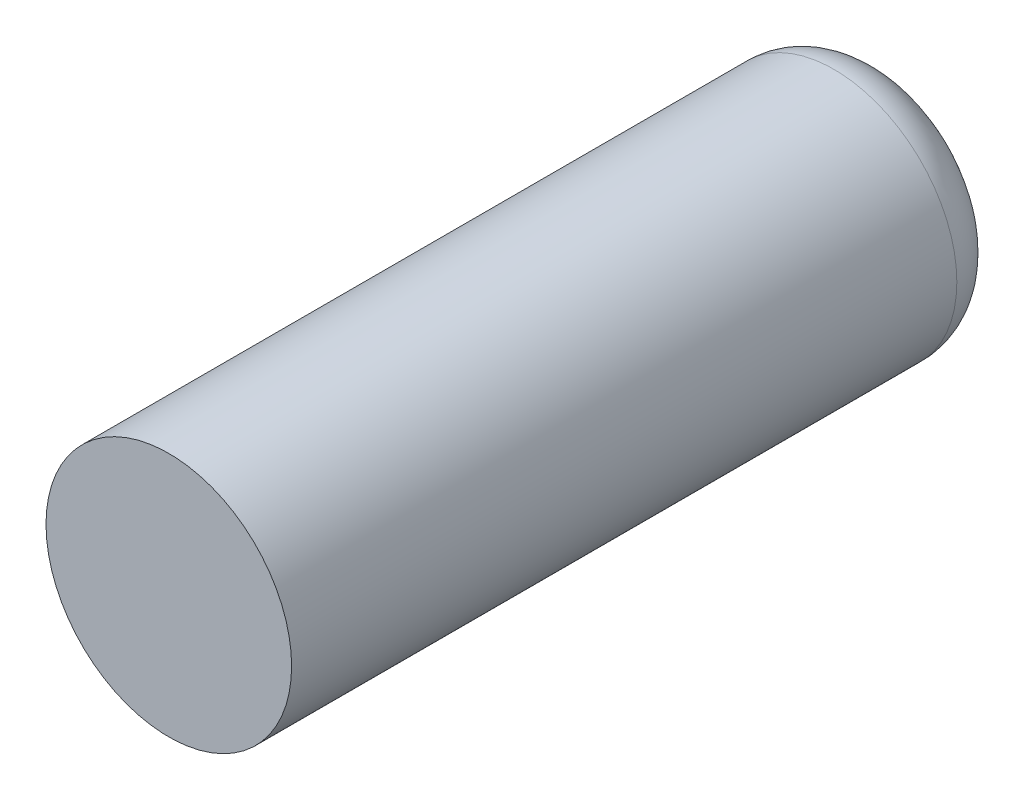
ISO-10303-21;
HEADER;
FILE_DESCRIPTION(('STEP AP214'),'2;1');
FILE_NAME('part.step','',(''),(''),'','','');
FILE_SCHEMA(('AUTOMOTIVE_DESIGN { 1 0 10303 214 1 1 1 1 }'));
ENDSEC;
DATA;
#1=APPLICATION_CONTEXT('core data for automotive mechanical design processes');
#2=APPLICATION_PROTOCOL_DEFINITION('international standard','automotive_design',2000,#1);
#3=PRODUCT_CONTEXT('',#1,'mechanical');
#4=PRODUCT('Part','Part','',(#3));
#5=PRODUCT_RELATED_PRODUCT_CATEGORY('part','',(#4));
#6=PRODUCT_DEFINITION_FORMATION('','',#4);
#7=PRODUCT_DEFINITION_CONTEXT('part definition',#1,'design');
#8=PRODUCT_DEFINITION('design','',#6,#7);
#9=PRODUCT_DEFINITION_SHAPE('','',#8);
#10=(LENGTH_UNIT() NAMED_UNIT(*) SI_UNIT(.MILLI.,.METRE.));
#11=(NAMED_UNIT(*) PLANE_ANGLE_UNIT() SI_UNIT($,.RADIAN.));
#12=(NAMED_UNIT(*) SI_UNIT($,.STERADIAN.) SOLID_ANGLE_UNIT());
#13=UNCERTAINTY_MEASURE_WITH_UNIT(LENGTH_MEASURE(1.E-05),#10,'distance_accuracy_value','');
#14=(GEOMETRIC_REPRESENTATION_CONTEXT(3) GLOBAL_UNCERTAINTY_ASSIGNED_CONTEXT((#13)) GLOBAL_UNIT_ASSIGNED_CONTEXT((#10,
#11,#12)) REPRESENTATION_CONTEXT('',''));
#15=CARTESIAN_POINT('',(0.,0.,0.));
#16=DIRECTION('',(0.,0.,1.));
#17=DIRECTION('',(1.,0.,0.));
#18=AXIS2_PLACEMENT_3D('',#15,#16,#17);
#19=CARTESIAN_POINT('',(0.,0.,14.));
#20=DIRECTION('',(0.,0.,-1.));
#21=DIRECTION('',(-1.,0.,0.));
#22=AXIS2_PLACEMENT_3D('',#19,#20,#21);
#23=CYLINDRICAL_SURFACE('',#22,2.4);
#24=CARTESIAN_POINT('',(0.,0.,0.999999999999999));
#25=DIRECTION('',(0.,0.,1.));
#26=DIRECTION('',(1.,0.,0.));
#27=AXIS2_PLACEMENT_3D('',#24,#25,#26);
#28=CIRCLE('',#27,2.4);
#29=CARTESIAN_POINT('',(2.4,0.,0.999999999999999));
#30=VERTEX_POINT('',#29);
#31=EDGE_CURVE('E47',#30,#30,#28,.T.);
#32=ORIENTED_EDGE('',*,*,#31,.T.);
#33=EDGE_LOOP('',(#32));
#34=FACE_BOUND('',#33,.T.);
#35=CARTESIAN_POINT('',(0.,0.,14.));
#36=DIRECTION('',(0.,0.,1.));
#37=DIRECTION('',(1.,0.,0.));
#38=AXIS2_PLACEMENT_3D('',#35,#36,#37);
#39=CIRCLE('',#38,2.4);
#40=CARTESIAN_POINT('',(2.4,0.,14.));
#41=VERTEX_POINT('',#40);
#42=EDGE_CURVE('E52',#41,#41,#39,.T.);
#43=ORIENTED_EDGE('',*,*,#42,.F.);
#44=EDGE_LOOP('',(#43));
#45=FACE_BOUND('',#44,.T.);
#46=ADVANCED_FACE('F39',(#34,#45),#23,.T.);
#47=CARTESIAN_POINT('',(0.,0.,14.));
#48=DIRECTION('',(0.,0.,1.));
#49=DIRECTION('',(1.,0.,0.));
#50=AXIS2_PLACEMENT_3D('',#47,#48,#49);
#51=PLANE('',#50);
#52=ORIENTED_EDGE('',*,*,#42,.T.);
#53=EDGE_LOOP('',(#52));
#54=FACE_BOUND('',#53,.T.);
#55=ADVANCED_FACE('F60',(#54),#51,.T.);
#56=CARTESIAN_POINT('',(0.,0.,0.));
#57=DIRECTION('',(0.,0.,1.));
#58=DIRECTION('',(1.,0.,0.));
#59=AXIS2_PLACEMENT_3D('',#56,#57,#58);
#60=PLANE('',#59);
#61=CARTESIAN_POINT('',(0.,0.,0.));
#62=DIRECTION('',(0.,0.,1.));
#63=DIRECTION('',(1.,0.,0.));
#64=AXIS2_PLACEMENT_3D('',#61,#62,#63);
#65=CIRCLE('',#64,1.4);
#66=CARTESIAN_POINT('',(1.4,0.,0.));
#67=VERTEX_POINT('',#66);
#68=EDGE_CURVE('E10',#67,#67,#65,.F.);
#69=ORIENTED_EDGE('',*,*,#68,.T.);
#70=EDGE_LOOP('',(#69));
#71=FACE_BOUND('',#70,.T.);
#72=ADVANCED_FACE('F66',(#71),#60,.F.);
#73=CARTESIAN_POINT('',(0.,0.,0.999999999999999));
#74=DIRECTION('',(0.,0.,1.));
#75=DIRECTION('',(1.,0.,0.));
#76=AXIS2_PLACEMENT_3D('',#73,#74,#75);
#77=TOROIDAL_SURFACE('',#76,1.4,1.);
#78=ORIENTED_EDGE('',*,*,#68,.F.);
#79=EDGE_LOOP('',(#78));
#80=FACE_BOUND('',#79,.T.);
#81=ORIENTED_EDGE('',*,*,#31,.F.);
#82=EDGE_LOOP('',(#81));
#83=FACE_BOUND('',#82,.T.);
#84=ADVANCED_FACE('F41',(#80,#83),#77,.T.);
#85=CLOSED_SHELL('',(#46,#55,#72,#84));
#86=MANIFOLD_SOLID_BREP('B2',#85);
#87=ADVANCED_BREP_SHAPE_REPRESENTATION('',(#18,#86),#14);
#88=SHAPE_DEFINITION_REPRESENTATION(#9,#87);
ENDSEC;
END-ISO-10303-21;
